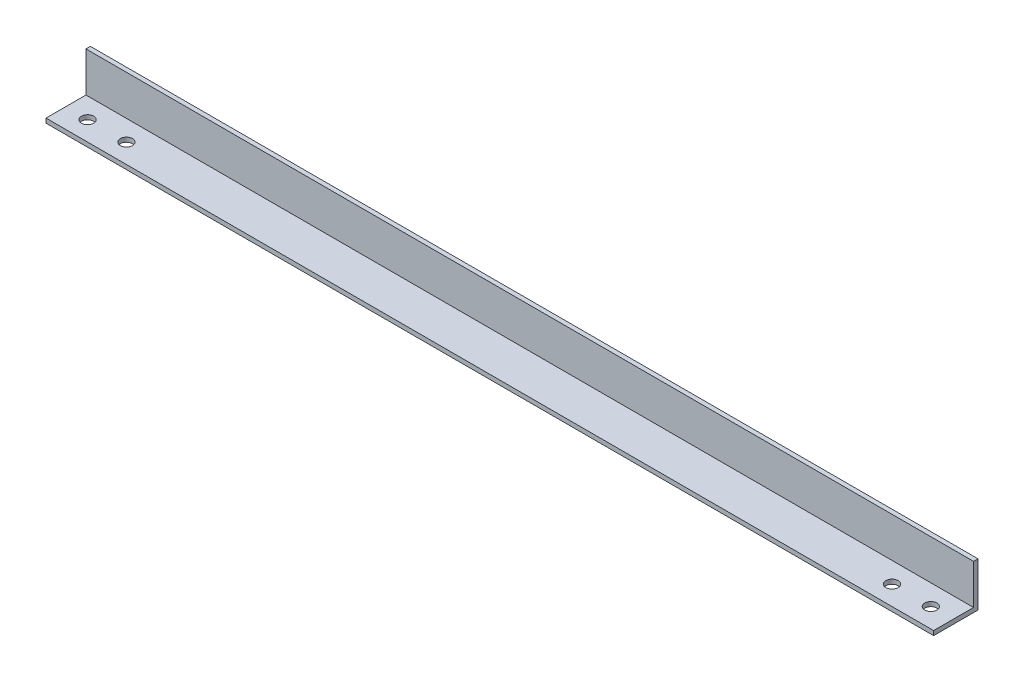
ISO-10303-21;
HEADER;
FILE_DESCRIPTION(('STEP AP214'),'2;1');
FILE_NAME('part.step','',(''),(''),'','','');
FILE_SCHEMA(('AUTOMOTIVE_DESIGN { 1 0 10303 214 1 1 1 1 }'));
ENDSEC;
DATA;
#1=APPLICATION_CONTEXT('core data for automotive mechanical design processes');
#2=APPLICATION_PROTOCOL_DEFINITION('international standard','automotive_design',2000,#1);
#3=PRODUCT_CONTEXT('',#1,'mechanical');
#4=PRODUCT('Part','Part','',(#3));
#5=PRODUCT_RELATED_PRODUCT_CATEGORY('part','',(#4));
#6=PRODUCT_DEFINITION_FORMATION('','',#4);
#7=PRODUCT_DEFINITION_CONTEXT('part definition',#1,'design');
#8=PRODUCT_DEFINITION('design','',#6,#7);
#9=PRODUCT_DEFINITION_SHAPE('','',#8);
#10=(LENGTH_UNIT() NAMED_UNIT(*) SI_UNIT(.MILLI.,.METRE.));
#11=(NAMED_UNIT(*) PLANE_ANGLE_UNIT() SI_UNIT($,.RADIAN.));
#12=(NAMED_UNIT(*) SI_UNIT($,.STERADIAN.) SOLID_ANGLE_UNIT());
#13=UNCERTAINTY_MEASURE_WITH_UNIT(LENGTH_MEASURE(1.E-05),#10,'distance_accuracy_value','');
#14=(GEOMETRIC_REPRESENTATION_CONTEXT(3) GLOBAL_UNCERTAINTY_ASSIGNED_CONTEXT((#13)) GLOBAL_UNIT_ASSIGNED_CONTEXT((#10,
#11,#12)) REPRESENTATION_CONTEXT('',''));
#15=CARTESIAN_POINT('',(0.,0.,0.));
#16=DIRECTION('',(0.,0.,1.));
#17=DIRECTION('',(1.,0.,0.));
#18=AXIS2_PLACEMENT_3D('',#15,#16,#17);
#19=CARTESIAN_POINT('',(0.,80.,8.));
#20=DIRECTION('',(0.,0.,-1.));
#21=DIRECTION('',(-1.,0.,0.));
#22=AXIS2_PLACEMENT_3D('',#19,#20,#21);
#23=PLANE('',#22);
#24=DIRECTION('',(-1.,0.,0.));
#25=VECTOR('',#24,1.);
#26=CARTESIAN_POINT('',(0.,8.00000000000001,8.));
#27=LINE('',#26,#25);
#28=CARTESIAN_POINT('',(1600.,8.00000000000001,8.));
#29=VERTEX_POINT('',#28);
#30=CARTESIAN_POINT('',(0.,8.00000000000001,8.));
#31=VERTEX_POINT('',#30);
#32=EDGE_CURVE('E48',#29,#31,#27,.T.);
#33=ORIENTED_EDGE('',*,*,#32,.F.);
#34=DIRECTION('',(0.,1.,0.));
#35=VECTOR('',#34,1.);
#36=CARTESIAN_POINT('',(1600.,0.,8.));
#37=LINE('',#36,#35);
#38=CARTESIAN_POINT('',(1600.,80.,8.));
#39=VERTEX_POINT('',#38);
#40=EDGE_CURVE('E108',#29,#39,#37,.T.);
#41=ORIENTED_EDGE('',*,*,#40,.T.);
#42=DIRECTION('',(-1.,0.,0.));
#43=VECTOR('',#42,1.);
#44=CARTESIAN_POINT('',(0.,80.,8.));
#45=LINE('',#44,#43);
#46=CARTESIAN_POINT('',(0.,80.,8.));
#47=VERTEX_POINT('',#46);
#48=EDGE_CURVE('E54',#39,#47,#45,.T.);
#49=ORIENTED_EDGE('',*,*,#48,.T.);
#50=DIRECTION('',(0.,-1.,0.));
#51=VECTOR('',#50,1.);
#52=CARTESIAN_POINT('',(0.,0.,8.));
#53=LINE('',#52,#51);
#54=EDGE_CURVE('E83',#47,#31,#53,.T.);
#55=ORIENTED_EDGE('',*,*,#54,.T.);
#56=EDGE_LOOP('',(#33,#41,#49,#55));
#57=FACE_BOUND('',#56,.T.);
#58=ADVANCED_FACE('F31',(#57),#23,.F.);
#59=CARTESIAN_POINT('',(0.,0.,8.));
#60=DIRECTION('',(1.,0.,0.));
#61=DIRECTION('',(0.,0.,-1.));
#62=AXIS2_PLACEMENT_3D('',#59,#60,#61);
#63=PLANE('',#62);
#64=DIRECTION('',(0.,-1.,0.));
#65=VECTOR('',#64,1.);
#66=CARTESIAN_POINT('',(0.,0.,0.));
#67=LINE('',#66,#65);
#68=CARTESIAN_POINT('',(0.,80.,0.));
#69=VERTEX_POINT('',#68);
#70=CARTESIAN_POINT('',(0.,0.,0.));
#71=VERTEX_POINT('',#70);
#72=EDGE_CURVE('E89',#69,#71,#67,.T.);
#73=ORIENTED_EDGE('',*,*,#72,.T.);
#74=DIRECTION('',(0.,0.,-1.));
#75=VECTOR('',#74,1.);
#76=CARTESIAN_POINT('',(0.,0.,8.));
#77=LINE('',#76,#75);
#78=CARTESIAN_POINT('',(0.,0.,80.));
#79=VERTEX_POINT('',#78);
#80=EDGE_CURVE('E11',#79,#71,#77,.T.);
#81=ORIENTED_EDGE('',*,*,#80,.F.);
#82=DIRECTION('',(0.,-1.,0.));
#83=VECTOR('',#82,1.);
#84=CARTESIAN_POINT('',(0.,0.,80.));
#85=LINE('',#84,#83);
#86=CARTESIAN_POINT('',(0.,8.00000000000001,80.));
#87=VERTEX_POINT('',#86);
#88=EDGE_CURVE('E118',#87,#79,#85,.T.);
#89=ORIENTED_EDGE('',*,*,#88,.F.);
#90=DIRECTION('',(0.,0.,-1.));
#91=VECTOR('',#90,1.);
#92=CARTESIAN_POINT('',(0.,8.00000000000001,80.));
#93=LINE('',#92,#91);
#94=EDGE_CURVE('E98',#87,#31,#93,.T.);
#95=ORIENTED_EDGE('',*,*,#94,.T.);
#96=ORIENTED_EDGE('',*,*,#54,.F.);
#97=DIRECTION('',(0.,0.,-1.));
#98=VECTOR('',#97,1.);
#99=CARTESIAN_POINT('',(0.,80.,8.));
#100=LINE('',#99,#98);
#101=EDGE_CURVE('E76',#47,#69,#100,.T.);
#102=ORIENTED_EDGE('',*,*,#101,.T.);
#103=EDGE_LOOP('',(#73,#81,#89,#95,#96,#102));
#104=FACE_BOUND('',#103,.T.);
#105=ADVANCED_FACE('F33',(#104),#63,.F.);
#106=CARTESIAN_POINT('',(0.,0.,8.));
#107=DIRECTION('',(0.,1.,0.));
#108=DIRECTION('',(0.,0.,1.));
#109=AXIS2_PLACEMENT_3D('',#106,#107,#108);
#110=PLANE('',#109);
#111=CARTESIAN_POINT('',(1560.,0.,45.0000000000001));
#112=DIRECTION('',(0.,1.,0.));
#113=DIRECTION('',(0.,0.,1.));
#114=AXIS2_PLACEMENT_3D('',#111,#112,#113);
#115=CIRCLE('',#114,10.9999999999999);
#116=CARTESIAN_POINT('',(1560.,0.,56.));
#117=VERTEX_POINT('',#116);
#118=EDGE_CURVE('E154',#117,#117,#115,.T.);
#119=ORIENTED_EDGE('',*,*,#118,.T.);
#120=EDGE_LOOP('',(#119));
#121=FACE_BOUND('',#120,.T.);
#122=CARTESIAN_POINT('',(1490.,0.,45.0000000000001));
#123=DIRECTION('',(0.,1.,0.));
#124=DIRECTION('',(0.,0.,1.));
#125=AXIS2_PLACEMENT_3D('',#122,#123,#124);
#126=CIRCLE('',#125,10.9999999999999);
#127=CARTESIAN_POINT('',(1490.,0.,56.0000000000001));
#128=VERTEX_POINT('',#127);
#129=EDGE_CURVE('E148',#128,#128,#126,.T.);
#130=ORIENTED_EDGE('',*,*,#129,.T.);
#131=EDGE_LOOP('',(#130));
#132=FACE_BOUND('',#131,.T.);
#133=CARTESIAN_POINT('',(110.,0.,45.0000000000001));
#134=DIRECTION('',(0.,1.,0.));
#135=DIRECTION('',(0.,0.,1.));
#136=AXIS2_PLACEMENT_3D('',#133,#134,#135);
#137=CIRCLE('',#136,11.);
#138=CARTESIAN_POINT('',(110.,0.,56.0000000000002));
#139=VERTEX_POINT('',#138);
#140=EDGE_CURVE('E142',#139,#139,#137,.T.);
#141=ORIENTED_EDGE('',*,*,#140,.T.);
#142=EDGE_LOOP('',(#141));
#143=FACE_BOUND('',#142,.T.);
#144=CARTESIAN_POINT('',(40.0000000000001,0.,45.0000000000001));
#145=DIRECTION('',(0.,1.,0.));
#146=DIRECTION('',(0.,0.,1.));
#147=AXIS2_PLACEMENT_3D('',#144,#145,#146);
#148=CIRCLE('',#147,11.);
#149=CARTESIAN_POINT('',(40.0000000000001,0.,56.0000000000001));
#150=VERTEX_POINT('',#149);
#151=EDGE_CURVE('E119',#150,#150,#148,.T.);
#152=ORIENTED_EDGE('',*,*,#151,.T.);
#153=EDGE_LOOP('',(#152));
#154=FACE_BOUND('',#153,.T.);
#155=DIRECTION('',(1.,0.,0.));
#156=VECTOR('',#155,1.);
#157=CARTESIAN_POINT('',(0.,0.,0.));
#158=LINE('',#157,#156);
#159=CARTESIAN_POINT('',(1600.,0.,0.));
#160=VERTEX_POINT('',#159);
#161=EDGE_CURVE('E93',#71,#160,#158,.T.);
#162=ORIENTED_EDGE('',*,*,#161,.T.);
#163=DIRECTION('',(0.,0.,-1.));
#164=VECTOR('',#163,1.);
#165=CARTESIAN_POINT('',(1600.,0.,8.));
#166=LINE('',#165,#164);
#167=CARTESIAN_POINT('',(1600.,0.,80.));
#168=VERTEX_POINT('',#167);
#169=EDGE_CURVE('E40',#168,#160,#166,.T.);
#170=ORIENTED_EDGE('',*,*,#169,.F.);
#171=DIRECTION('',(1.,0.,0.));
#172=VECTOR('',#171,1.);
#173=CARTESIAN_POINT('',(0.,0.,80.));
#174=LINE('',#173,#172);
#175=EDGE_CURVE('E131',#79,#168,#174,.T.);
#176=ORIENTED_EDGE('',*,*,#175,.F.);
#177=ORIENTED_EDGE('',*,*,#80,.T.);
#178=EDGE_LOOP('',(#162,#170,#176,#177));
#179=FACE_BOUND('',#178,.T.);
#180=ADVANCED_FACE('F163',(#121,#132,#143,#154,#179),#110,.F.);
#181=CARTESIAN_POINT('',(1600.,0.,8.));
#182=DIRECTION('',(-1.,0.,0.));
#183=DIRECTION('',(0.,0.,1.));
#184=AXIS2_PLACEMENT_3D('',#181,#182,#183);
#185=PLANE('',#184);
#186=DIRECTION('',(0.,1.,0.));
#187=VECTOR('',#186,1.);
#188=CARTESIAN_POINT('',(1600.,0.,0.));
#189=LINE('',#188,#187);
#190=CARTESIAN_POINT('',(1600.,80.,0.));
#191=VERTEX_POINT('',#190);
#192=EDGE_CURVE('E84',#160,#191,#189,.T.);
#193=ORIENTED_EDGE('',*,*,#192,.T.);
#194=DIRECTION('',(0.,0.,-1.));
#195=VECTOR('',#194,1.);
#196=CARTESIAN_POINT('',(1600.,80.,8.));
#197=LINE('',#196,#195);
#198=EDGE_CURVE('E79',#39,#191,#197,.T.);
#199=ORIENTED_EDGE('',*,*,#198,.F.);
#200=ORIENTED_EDGE('',*,*,#40,.F.);
#201=DIRECTION('',(0.,0.,-1.));
#202=VECTOR('',#201,1.);
#203=CARTESIAN_POINT('',(1600.,8.00000000000001,80.));
#204=LINE('',#203,#202);
#205=CARTESIAN_POINT('',(1600.,8.00000000000001,80.));
#206=VERTEX_POINT('',#205);
#207=EDGE_CURVE('E94',#206,#29,#204,.T.);
#208=ORIENTED_EDGE('',*,*,#207,.F.);
#209=DIRECTION('',(0.,1.,0.));
#210=VECTOR('',#209,1.);
#211=CARTESIAN_POINT('',(1600.,0.,80.));
#212=LINE('',#211,#210);
#213=EDGE_CURVE('E126',#168,#206,#212,.T.);
#214=ORIENTED_EDGE('',*,*,#213,.F.);
#215=ORIENTED_EDGE('',*,*,#169,.T.);
#216=EDGE_LOOP('',(#193,#199,#200,#208,#214,#215));
#217=FACE_BOUND('',#216,.T.);
#218=ADVANCED_FACE('F194',(#217),#185,.F.);
#219=CARTESIAN_POINT('',(0.,80.,8.));
#220=DIRECTION('',(0.,-1.,0.));
#221=DIRECTION('',(0.,0.,-1.));
#222=AXIS2_PLACEMENT_3D('',#219,#220,#221);
#223=PLANE('',#222);
#224=DIRECTION('',(-1.,0.,0.));
#225=VECTOR('',#224,1.);
#226=CARTESIAN_POINT('',(0.,80.,0.));
#227=LINE('',#226,#225);
#228=EDGE_CURVE('E73',#191,#69,#227,.T.);
#229=ORIENTED_EDGE('',*,*,#228,.T.);
#230=ORIENTED_EDGE('',*,*,#101,.F.);
#231=ORIENTED_EDGE('',*,*,#48,.F.);
#232=ORIENTED_EDGE('',*,*,#198,.T.);
#233=EDGE_LOOP('',(#229,#230,#231,#232));
#234=FACE_BOUND('',#233,.T.);
#235=ADVANCED_FACE('F75',(#234),#223,.F.);
#236=CARTESIAN_POINT('',(0.,80.,0.));
#237=DIRECTION('',(0.,0.,-1.));
#238=DIRECTION('',(-1.,0.,0.));
#239=AXIS2_PLACEMENT_3D('',#236,#237,#238);
#240=PLANE('',#239);
#241=ORIENTED_EDGE('',*,*,#72,.F.);
#242=ORIENTED_EDGE('',*,*,#228,.F.);
#243=ORIENTED_EDGE('',*,*,#192,.F.);
#244=ORIENTED_EDGE('',*,*,#161,.F.);
#245=EDGE_LOOP('',(#241,#242,#243,#244));
#246=FACE_BOUND('',#245,.T.);
#247=ADVANCED_FACE('F92',(#246),#240,.T.);
#248=CARTESIAN_POINT('',(0.,8.00000000000001,80.));
#249=DIRECTION('',(0.,-1.,0.));
#250=DIRECTION('',(0.,0.,-1.));
#251=AXIS2_PLACEMENT_3D('',#248,#249,#250);
#252=PLANE('',#251);
#253=CARTESIAN_POINT('',(1560.,8.00000000000001,45.0000000000001));
#254=DIRECTION('',(0.,1.,0.));
#255=DIRECTION('',(0.,0.,1.));
#256=AXIS2_PLACEMENT_3D('',#253,#254,#255);
#257=CIRCLE('',#256,10.9999999999999);
#258=CARTESIAN_POINT('',(1560.,8.00000000000001,56.));
#259=VERTEX_POINT('',#258);
#260=EDGE_CURVE('E157',#259,#259,#257,.T.);
#261=ORIENTED_EDGE('',*,*,#260,.F.);
#262=EDGE_LOOP('',(#261));
#263=FACE_BOUND('',#262,.T.);
#264=CARTESIAN_POINT('',(1490.,8.00000000000001,45.0000000000001));
#265=DIRECTION('',(0.,1.,0.));
#266=DIRECTION('',(0.,0.,1.));
#267=AXIS2_PLACEMENT_3D('',#264,#265,#266);
#268=CIRCLE('',#267,10.9999999999999);
#269=CARTESIAN_POINT('',(1490.,8.00000000000001,56.0000000000001));
#270=VERTEX_POINT('',#269);
#271=EDGE_CURVE('E151',#270,#270,#268,.T.);
#272=ORIENTED_EDGE('',*,*,#271,.F.);
#273=EDGE_LOOP('',(#272));
#274=FACE_BOUND('',#273,.T.);
#275=CARTESIAN_POINT('',(110.,8.00000000000001,45.0000000000001));
#276=DIRECTION('',(0.,1.,0.));
#277=DIRECTION('',(0.,0.,1.));
#278=AXIS2_PLACEMENT_3D('',#275,#276,#277);
#279=CIRCLE('',#278,11.);
#280=CARTESIAN_POINT('',(110.,8.00000000000001,56.0000000000002));
#281=VERTEX_POINT('',#280);
#282=EDGE_CURVE('E145',#281,#281,#279,.T.);
#283=ORIENTED_EDGE('',*,*,#282,.F.);
#284=EDGE_LOOP('',(#283));
#285=FACE_BOUND('',#284,.T.);
#286=CARTESIAN_POINT('',(40.0000000000001,8.00000000000001,45.0000000000001));
#287=DIRECTION('',(0.,1.,0.));
#288=DIRECTION('',(0.,0.,1.));
#289=AXIS2_PLACEMENT_3D('',#286,#287,#288);
#290=CIRCLE('',#289,11.);
#291=CARTESIAN_POINT('',(40.0000000000001,8.00000000000001,56.0000000000001));
#292=VERTEX_POINT('',#291);
#293=EDGE_CURVE('E139',#292,#292,#290,.T.);
#294=ORIENTED_EDGE('',*,*,#293,.F.);
#295=EDGE_LOOP('',(#294));
#296=FACE_BOUND('',#295,.T.);
#297=ORIENTED_EDGE('',*,*,#32,.T.);
#298=ORIENTED_EDGE('',*,*,#94,.F.);
#299=DIRECTION('',(-1.,0.,0.));
#300=VECTOR('',#299,1.);
#301=CARTESIAN_POINT('',(0.,8.00000000000001,80.));
#302=LINE('',#301,#300);
#303=EDGE_CURVE('E115',#206,#87,#302,.T.);
#304=ORIENTED_EDGE('',*,*,#303,.F.);
#305=ORIENTED_EDGE('',*,*,#207,.T.);
#306=EDGE_LOOP('',(#297,#298,#304,#305));
#307=FACE_BOUND('',#306,.T.);
#308=ADVANCED_FACE('F173',(#263,#274,#285,#296,#307),#252,.F.);
#309=CARTESIAN_POINT('',(0.,8.00000000000001,80.));
#310=DIRECTION('',(0.,0.,-1.));
#311=DIRECTION('',(-1.,0.,0.));
#312=AXIS2_PLACEMENT_3D('',#309,#310,#311);
#313=PLANE('',#312);
#314=ORIENTED_EDGE('',*,*,#88,.T.);
#315=ORIENTED_EDGE('',*,*,#175,.T.);
#316=ORIENTED_EDGE('',*,*,#213,.T.);
#317=ORIENTED_EDGE('',*,*,#303,.T.);
#318=EDGE_LOOP('',(#314,#315,#316,#317));
#319=FACE_BOUND('',#318,.T.);
#320=ADVANCED_FACE('F176',(#319),#313,.F.);
#321=CARTESIAN_POINT('',(40.0000000000001,0.,45.0000000000001));
#322=DIRECTION('',(0.,1.,0.));
#323=DIRECTION('',(0.,0.,1.));
#324=AXIS2_PLACEMENT_3D('',#321,#322,#323);
#325=CYLINDRICAL_SURFACE('',#324,11.);
#326=ORIENTED_EDGE('',*,*,#151,.F.);
#327=EDGE_LOOP('',(#326));
#328=FACE_BOUND('',#327,.T.);
#329=ORIENTED_EDGE('',*,*,#293,.T.);
#330=EDGE_LOOP('',(#329));
#331=FACE_BOUND('',#330,.T.);
#332=ADVANCED_FACE('F235',(#328,#331),#325,.F.);
#333=CARTESIAN_POINT('',(110.,0.,45.0000000000001));
#334=DIRECTION('',(0.,1.,0.));
#335=DIRECTION('',(0.,0.,1.));
#336=AXIS2_PLACEMENT_3D('',#333,#334,#335);
#337=CYLINDRICAL_SURFACE('',#336,11.);
#338=ORIENTED_EDGE('',*,*,#140,.F.);
#339=EDGE_LOOP('',(#338));
#340=FACE_BOUND('',#339,.T.);
#341=ORIENTED_EDGE('',*,*,#282,.T.);
#342=EDGE_LOOP('',(#341));
#343=FACE_BOUND('',#342,.T.);
#344=ADVANCED_FACE('F240',(#340,#343),#337,.F.);
#345=CARTESIAN_POINT('',(1490.,0.,45.0000000000001));
#346=DIRECTION('',(0.,1.,0.));
#347=DIRECTION('',(0.,0.,1.));
#348=AXIS2_PLACEMENT_3D('',#345,#346,#347);
#349=CYLINDRICAL_SURFACE('',#348,10.9999999999999);
#350=ORIENTED_EDGE('',*,*,#129,.F.);
#351=EDGE_LOOP('',(#350));
#352=FACE_BOUND('',#351,.T.);
#353=ORIENTED_EDGE('',*,*,#271,.T.);
#354=EDGE_LOOP('',(#353));
#355=FACE_BOUND('',#354,.T.);
#356=ADVANCED_FACE('F169',(#352,#355),#349,.F.);
#357=CARTESIAN_POINT('',(1560.,0.,45.0000000000001));
#358=DIRECTION('',(0.,1.,0.));
#359=DIRECTION('',(0.,0.,1.));
#360=AXIS2_PLACEMENT_3D('',#357,#358,#359);
#361=CYLINDRICAL_SURFACE('',#360,10.9999999999999);
#362=ORIENTED_EDGE('',*,*,#118,.F.);
#363=EDGE_LOOP('',(#362));
#364=FACE_BOUND('',#363,.T.);
#365=ORIENTED_EDGE('',*,*,#260,.T.);
#366=EDGE_LOOP('',(#365));
#367=FACE_BOUND('',#366,.T.);
#368=ADVANCED_FACE('F166',(#364,#367),#361,.F.);
#369=CLOSED_SHELL('',(#58,#105,#180,#218,#235,#247,#308,#320,#332,#344,#356,#368));
#370=MANIFOLD_SOLID_BREP('B2',#369);
#371=ADVANCED_BREP_SHAPE_REPRESENTATION('',(#18,#370),#14);
#372=SHAPE_DEFINITION_REPRESENTATION(#9,#371);
ENDSEC;
END-ISO-10303-21;
